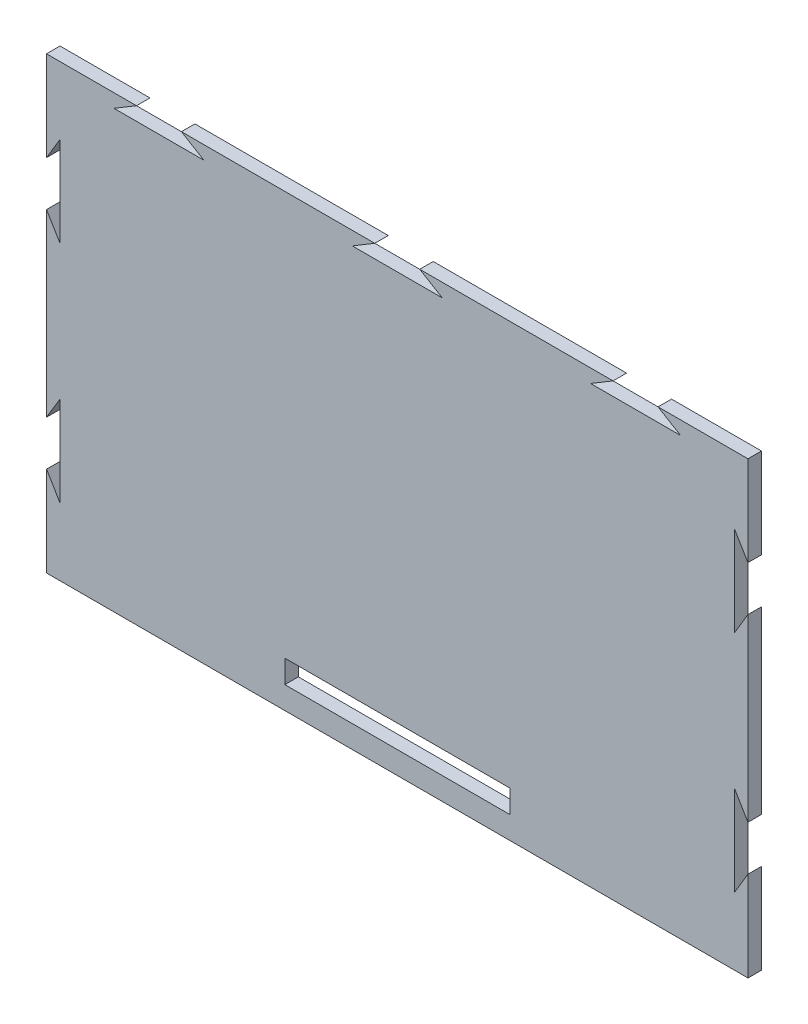
ISO-10303-21;
HEADER;
FILE_DESCRIPTION(('STEP AP214'),'2;1');
FILE_NAME('part.step','',(''),(''),'','','');
FILE_SCHEMA(('AUTOMOTIVE_DESIGN { 1 0 10303 214 1 1 1 1 }'));
ENDSEC;
DATA;
#1=APPLICATION_CONTEXT('core data for automotive mechanical design processes');
#2=APPLICATION_PROTOCOL_DEFINITION('international standard','automotive_design',2000,#1);
#3=PRODUCT_CONTEXT('',#1,'mechanical');
#4=PRODUCT('Part','Part','',(#3));
#5=PRODUCT_RELATED_PRODUCT_CATEGORY('part','',(#4));
#6=PRODUCT_DEFINITION_FORMATION('','',#4);
#7=PRODUCT_DEFINITION_CONTEXT('part definition',#1,'design');
#8=PRODUCT_DEFINITION('design','',#6,#7);
#9=PRODUCT_DEFINITION_SHAPE('','',#8);
#10=(LENGTH_UNIT() NAMED_UNIT(*) SI_UNIT(.MILLI.,.METRE.));
#11=(NAMED_UNIT(*) PLANE_ANGLE_UNIT() SI_UNIT($,.RADIAN.));
#12=(NAMED_UNIT(*) SI_UNIT($,.STERADIAN.) SOLID_ANGLE_UNIT());
#13=UNCERTAINTY_MEASURE_WITH_UNIT(LENGTH_MEASURE(1.E-05),#10,'distance_accuracy_value','');
#14=(GEOMETRIC_REPRESENTATION_CONTEXT(3) GLOBAL_UNCERTAINTY_ASSIGNED_CONTEXT((#13)) GLOBAL_UNIT_ASSIGNED_CONTEXT((#10,
#11,#12)) REPRESENTATION_CONTEXT('',''));
#15=CARTESIAN_POINT('',(0.,0.,0.));
#16=DIRECTION('',(0.,0.,1.));
#17=DIRECTION('',(1.,0.,0.));
#18=AXIS2_PLACEMENT_3D('',#15,#16,#17);
#19=CARTESIAN_POINT('',(-78.,-50.,3.));
#20=DIRECTION('',(1.,0.,0.));
#21=DIRECTION('',(0.,0.,-1.));
#22=AXIS2_PLACEMENT_3D('',#19,#20,#21);
#23=PLANE('',#22);
#24=DIRECTION('',(0.,-1.,0.));
#25=VECTOR('',#24,1.);
#26=CARTESIAN_POINT('',(-78.,-50.,3.));
#27=LINE('',#26,#25);
#28=CARTESIAN_POINT('',(-78.,20.,3.));
#29=VERTEX_POINT('',#28);
#30=CARTESIAN_POINT('',(-78.,-20.,3.));
#31=VERTEX_POINT('',#30);
#32=EDGE_CURVE('E500',#29,#31,#27,.T.);
#33=ORIENTED_EDGE('',*,*,#32,.F.);
#34=DIRECTION('',(0.,0.,-1.));
#35=VECTOR('',#34,1.);
#36=CARTESIAN_POINT('',(-78.,20.,3.));
#37=LINE('',#36,#35);
#38=CARTESIAN_POINT('',(-78.,20.,0.));
#39=VERTEX_POINT('',#38);
#40=EDGE_CURVE('E322',#29,#39,#37,.T.);
#41=ORIENTED_EDGE('',*,*,#40,.T.);
#42=DIRECTION('',(0.,-1.,0.));
#43=VECTOR('',#42,1.);
#44=CARTESIAN_POINT('',(-78.,-50.,0.));
#45=LINE('',#44,#43);
#46=CARTESIAN_POINT('',(-78.0000000000001,-20.0000000000001,0.));
#47=VERTEX_POINT('',#46);
#48=EDGE_CURVE('E517',#39,#47,#45,.T.);
#49=ORIENTED_EDGE('',*,*,#48,.T.);
#50=DIRECTION('',(0.,0.,-1.));
#51=VECTOR('',#50,1.);
#52=CARTESIAN_POINT('',(-78.,-20.,3.));
#53=LINE('',#52,#51);
#54=EDGE_CURVE('E341',#31,#47,#53,.T.);
#55=ORIENTED_EDGE('',*,*,#54,.F.);
#56=EDGE_LOOP('',(#33,#41,#49,#55));
#57=FACE_BOUND('',#56,.T.);
#58=ADVANCED_FACE('F33',(#57),#23,.F.);
#59=CARTESIAN_POINT('',(-78.,-30.,3.));
#60=VERTEX_POINT('',#59);
#61=CARTESIAN_POINT('',(-78.,-50.,3.));
#62=VERTEX_POINT('',#61);
#63=EDGE_CURVE('E494',#60,#62,#27,.T.);
#64=ORIENTED_EDGE('',*,*,#63,.F.);
#65=DIRECTION('',(0.,0.,-1.));
#66=VECTOR('',#65,1.);
#67=CARTESIAN_POINT('',(-78.,-30.,3.));
#68=LINE('',#67,#66);
#69=CARTESIAN_POINT('',(-78.,-30.,0.));
#70=VERTEX_POINT('',#69);
#71=EDGE_CURVE('E318',#60,#70,#68,.T.);
#72=ORIENTED_EDGE('',*,*,#71,.T.);
#73=CARTESIAN_POINT('',(-78.,-50.,0.));
#74=VERTEX_POINT('',#73);
#75=EDGE_CURVE('E511',#70,#74,#45,.T.);
#76=ORIENTED_EDGE('',*,*,#75,.T.);
#77=DIRECTION('',(0.,0.,-1.));
#78=VECTOR('',#77,1.);
#79=CARTESIAN_POINT('',(-78.,-50.,3.));
#80=LINE('',#79,#78);
#81=EDGE_CURVE('E521',#62,#74,#80,.T.);
#82=ORIENTED_EDGE('',*,*,#81,.F.);
#83=EDGE_LOOP('',(#64,#72,#76,#82));
#84=FACE_BOUND('',#83,.T.);
#85=ADVANCED_FACE('F595',(#84),#23,.F.);
#86=CARTESIAN_POINT('',(78.,-50.,3.));
#87=DIRECTION('',(-1.,0.,0.));
#88=DIRECTION('',(0.,0.,1.));
#89=AXIS2_PLACEMENT_3D('',#86,#87,#88);
#90=PLANE('',#89);
#91=DIRECTION('',(0.,1.,0.));
#92=VECTOR('',#91,1.);
#93=CARTESIAN_POINT('',(78.,-50.,3.));
#94=LINE('',#93,#92);
#95=CARTESIAN_POINT('',(78.,30.,3.));
#96=VERTEX_POINT('',#95);
#97=CARTESIAN_POINT('',(78.,50.,3.));
#98=VERTEX_POINT('',#97);
#99=EDGE_CURVE('E490',#96,#98,#94,.T.);
#100=ORIENTED_EDGE('',*,*,#99,.F.);
#101=DIRECTION('',(0.,0.,-1.));
#102=VECTOR('',#101,1.);
#103=CARTESIAN_POINT('',(78.,30.,3.));
#104=LINE('',#103,#102);
#105=CARTESIAN_POINT('',(78.,30.,0.));
#106=VERTEX_POINT('',#105);
#107=EDGE_CURVE('E374',#96,#106,#104,.T.);
#108=ORIENTED_EDGE('',*,*,#107,.T.);
#109=DIRECTION('',(0.,1.,0.));
#110=VECTOR('',#109,1.);
#111=CARTESIAN_POINT('',(78.,-50.,0.));
#112=LINE('',#111,#110);
#113=CARTESIAN_POINT('',(78.,50.,0.));
#114=VERTEX_POINT('',#113);
#115=EDGE_CURVE('E429',#106,#114,#112,.T.);
#116=ORIENTED_EDGE('',*,*,#115,.T.);
#117=DIRECTION('',(0.,0.,-1.));
#118=VECTOR('',#117,1.);
#119=CARTESIAN_POINT('',(78.,50.,3.));
#120=LINE('',#119,#118);
#121=EDGE_CURVE('E11',#98,#114,#120,.T.);
#122=ORIENTED_EDGE('',*,*,#121,.F.);
#123=EDGE_LOOP('',(#100,#108,#116,#122));
#124=FACE_BOUND('',#123,.T.);
#125=ADVANCED_FACE('F590',(#124),#90,.F.);
#126=CARTESIAN_POINT('',(78.,-20.,0.));
#127=VERTEX_POINT('',#126);
#128=CARTESIAN_POINT('',(78.,20.,0.));
#129=VERTEX_POINT('',#128);
#130=EDGE_CURVE('E507',#127,#129,#112,.T.);
#131=ORIENTED_EDGE('',*,*,#130,.T.);
#132=DIRECTION('',(0.,0.,-1.));
#133=VECTOR('',#132,1.);
#134=CARTESIAN_POINT('',(78.,20.,3.));
#135=LINE('',#134,#133);
#136=CARTESIAN_POINT('',(78.,20.,3.));
#137=VERTEX_POINT('',#136);
#138=EDGE_CURVE('E365',#137,#129,#135,.T.);
#139=ORIENTED_EDGE('',*,*,#138,.F.);
#140=CARTESIAN_POINT('',(78.,-20.,3.));
#141=VERTEX_POINT('',#140);
#142=EDGE_CURVE('E489',#141,#137,#94,.T.);
#143=ORIENTED_EDGE('',*,*,#142,.F.);
#144=DIRECTION('',(0.,0.,-1.));
#145=VECTOR('',#144,1.);
#146=CARTESIAN_POINT('',(78.,-20.,3.));
#147=LINE('',#146,#145);
#148=EDGE_CURVE('E370',#141,#127,#147,.T.);
#149=ORIENTED_EDGE('',*,*,#148,.T.);
#150=EDGE_LOOP('',(#131,#139,#143,#149));
#151=FACE_BOUND('',#150,.T.);
#152=ADVANCED_FACE('F591',(#151),#90,.F.);
#153=CARTESIAN_POINT('',(-78.,50.,3.));
#154=DIRECTION('',(0.,-1.,0.));
#155=DIRECTION('',(0.,0.,-1.));
#156=AXIS2_PLACEMENT_3D('',#153,#154,#155);
#157=PLANE('',#156);
#158=DIRECTION('',(-1.,0.,0.));
#159=VECTOR('',#158,1.);
#160=CARTESIAN_POINT('',(-78.,50.,3.));
#161=LINE('',#160,#159);
#162=CARTESIAN_POINT('',(48.,50.,3.));
#163=VERTEX_POINT('',#162);
#164=CARTESIAN_POINT('',(5.,50.,3.));
#165=VERTEX_POINT('',#164);
#166=EDGE_CURVE('E495',#163,#165,#161,.T.);
#167=ORIENTED_EDGE('',*,*,#166,.F.);
#168=DIRECTION('',(0.,0.,-1.));
#169=VECTOR('',#168,1.);
#170=CARTESIAN_POINT('',(48.,50.,3.));
#171=LINE('',#170,#169);
#172=CARTESIAN_POINT('',(48.,50.,0.));
#173=VERTEX_POINT('',#172);
#174=EDGE_CURVE('E426',#163,#173,#171,.T.);
#175=ORIENTED_EDGE('',*,*,#174,.T.);
#176=DIRECTION('',(-1.,0.,0.));
#177=VECTOR('',#176,1.);
#178=CARTESIAN_POINT('',(-78.,50.,0.));
#179=LINE('',#178,#177);
#180=CARTESIAN_POINT('',(5.,50.,0.));
#181=VERTEX_POINT('',#180);
#182=EDGE_CURVE('E512',#173,#181,#179,.T.);
#183=ORIENTED_EDGE('',*,*,#182,.T.);
#184=DIRECTION('',(0.,0.,-1.));
#185=VECTOR('',#184,1.);
#186=CARTESIAN_POINT('',(5.,50.,3.));
#187=LINE('',#186,#185);
#188=EDGE_CURVE('E454',#165,#181,#187,.T.);
#189=ORIENTED_EDGE('',*,*,#188,.F.);
#190=EDGE_LOOP('',(#167,#175,#183,#189));
#191=FACE_BOUND('',#190,.T.);
#192=ADVANCED_FACE('F551',(#191),#157,.F.);
#193=CARTESIAN_POINT('',(57.9999999999998,50.,0.));
#194=VERTEX_POINT('',#193);
#195=EDGE_CURVE('E508',#114,#194,#179,.T.);
#196=ORIENTED_EDGE('',*,*,#195,.T.);
#197=DIRECTION('',(0.,0.,-1.));
#198=VECTOR('',#197,1.);
#199=CARTESIAN_POINT('',(58.,50.,3.));
#200=LINE('',#199,#198);
#201=CARTESIAN_POINT('',(58.,50.,3.));
#202=VERTEX_POINT('',#201);
#203=EDGE_CURVE('E417',#202,#194,#200,.T.);
#204=ORIENTED_EDGE('',*,*,#203,.F.);
#205=EDGE_CURVE('E491',#98,#202,#161,.T.);
#206=ORIENTED_EDGE('',*,*,#205,.F.);
#207=ORIENTED_EDGE('',*,*,#121,.T.);
#208=EDGE_LOOP('',(#196,#204,#206,#207));
#209=FACE_BOUND('',#208,.T.);
#210=ADVANCED_FACE('F583',(#209),#157,.F.);
#211=CARTESIAN_POINT('',(-58.,50.,3.));
#212=VERTEX_POINT('',#211);
#213=CARTESIAN_POINT('',(-78.,50.,3.));
#214=VERTEX_POINT('',#213);
#215=EDGE_CURVE('E488',#212,#214,#161,.T.);
#216=ORIENTED_EDGE('',*,*,#215,.F.);
#217=DIRECTION('',(0.,0.,-1.));
#218=VECTOR('',#217,1.);
#219=CARTESIAN_POINT('',(-58.,50.,3.));
#220=LINE('',#219,#218);
#221=CARTESIAN_POINT('',(-58.,50.,0.));
#222=VERTEX_POINT('',#221);
#223=EDGE_CURVE('E449',#212,#222,#220,.T.);
#224=ORIENTED_EDGE('',*,*,#223,.T.);
#225=CARTESIAN_POINT('',(-78.,50.,0.));
#226=VERTEX_POINT('',#225);
#227=EDGE_CURVE('E506',#222,#226,#179,.T.);
#228=ORIENTED_EDGE('',*,*,#227,.T.);
#229=DIRECTION('',(0.,0.,-1.));
#230=VECTOR('',#229,1.);
#231=CARTESIAN_POINT('',(-78.,50.,3.));
#232=LINE('',#231,#230);
#233=EDGE_CURVE('E41',#214,#226,#232,.T.);
#234=ORIENTED_EDGE('',*,*,#233,.F.);
#235=EDGE_LOOP('',(#216,#224,#228,#234));
#236=FACE_BOUND('',#235,.T.);
#237=ADVANCED_FACE('F581',(#236),#157,.F.);
#238=CARTESIAN_POINT('',(78.,-50.,0.));
#239=VERTEX_POINT('',#238);
#240=CARTESIAN_POINT('',(78.,-30.,0.));
#241=VERTEX_POINT('',#240);
#242=EDGE_CURVE('E503',#239,#241,#112,.T.);
#243=ORIENTED_EDGE('',*,*,#242,.T.);
#244=DIRECTION('',(0.,0.,-1.));
#245=VECTOR('',#244,1.);
#246=CARTESIAN_POINT('',(78.,-30.,3.));
#247=LINE('',#246,#245);
#248=CARTESIAN_POINT('',(78.,-30.,3.));
#249=VERTEX_POINT('',#248);
#250=EDGE_CURVE('E393',#249,#241,#247,.T.);
#251=ORIENTED_EDGE('',*,*,#250,.F.);
#252=CARTESIAN_POINT('',(78.,-50.,3.));
#253=VERTEX_POINT('',#252);
#254=EDGE_CURVE('E485',#253,#249,#94,.T.);
#255=ORIENTED_EDGE('',*,*,#254,.F.);
#256=DIRECTION('',(0.,0.,-1.));
#257=VECTOR('',#256,1.);
#258=CARTESIAN_POINT('',(78.,-50.,3.));
#259=LINE('',#258,#257);
#260=EDGE_CURVE('E502',#253,#239,#259,.T.);
#261=ORIENTED_EDGE('',*,*,#260,.T.);
#262=EDGE_LOOP('',(#243,#251,#255,#261));
#263=FACE_BOUND('',#262,.T.);
#264=ADVANCED_FACE('F35',(#263),#90,.F.);
#265=CARTESIAN_POINT('',(-5.,50.,3.));
#266=VERTEX_POINT('',#265);
#267=CARTESIAN_POINT('',(-48.,50.,3.));
#268=VERTEX_POINT('',#267);
#269=EDGE_CURVE('E543',#266,#268,#161,.T.);
#270=ORIENTED_EDGE('',*,*,#269,.F.);
#271=DIRECTION('',(0.,0.,-1.));
#272=VECTOR('',#271,1.);
#273=CARTESIAN_POINT('',(-5.,50.,3.));
#274=LINE('',#273,#272);
#275=CARTESIAN_POINT('',(-5.,50.,0.));
#276=VERTEX_POINT('',#275);
#277=EDGE_CURVE('E456',#266,#276,#274,.T.);
#278=ORIENTED_EDGE('',*,*,#277,.T.);
#279=CARTESIAN_POINT('',(-48.0000000000001,50.,0.));
#280=VERTEX_POINT('',#279);
#281=EDGE_CURVE('E571',#276,#280,#179,.T.);
#282=ORIENTED_EDGE('',*,*,#281,.T.);
#283=DIRECTION('',(0.,0.,-1.));
#284=VECTOR('',#283,1.);
#285=CARTESIAN_POINT('',(-48.,50.,3.));
#286=LINE('',#285,#284);
#287=EDGE_CURVE('E471',#268,#280,#286,.T.);
#288=ORIENTED_EDGE('',*,*,#287,.F.);
#289=EDGE_LOOP('',(#270,#278,#282,#288));
#290=FACE_BOUND('',#289,.T.);
#291=ADVANCED_FACE('F569',(#290),#157,.F.);
#292=CARTESIAN_POINT('',(-78.,30.,0.));
#293=VERTEX_POINT('',#292);
#294=EDGE_CURVE('E513',#226,#293,#45,.T.);
#295=ORIENTED_EDGE('',*,*,#294,.T.);
#296=DIRECTION('',(0.,0.,-1.));
#297=VECTOR('',#296,1.);
#298=CARTESIAN_POINT('',(-78.,30.,3.));
#299=LINE('',#298,#297);
#300=CARTESIAN_POINT('',(-78.,30.,3.));
#301=VERTEX_POINT('',#300);
#302=EDGE_CURVE('E313',#301,#293,#299,.T.);
#303=ORIENTED_EDGE('',*,*,#302,.F.);
#304=EDGE_CURVE('E496',#214,#301,#27,.T.);
#305=ORIENTED_EDGE('',*,*,#304,.F.);
#306=ORIENTED_EDGE('',*,*,#233,.T.);
#307=EDGE_LOOP('',(#295,#303,#305,#306));
#308=FACE_BOUND('',#307,.T.);
#309=ADVANCED_FACE('F528',(#308),#23,.F.);
#310=CARTESIAN_POINT('',(-78.,-50.,3.));
#311=DIRECTION('',(0.,1.,0.));
#312=DIRECTION('',(0.,0.,1.));
#313=AXIS2_PLACEMENT_3D('',#310,#311,#312);
#314=PLANE('',#313);
#315=DIRECTION('',(1.,0.,0.));
#316=VECTOR('',#315,1.);
#317=CARTESIAN_POINT('',(-78.,-50.,0.));
#318=LINE('',#317,#316);
#319=EDGE_CURVE('E516',#74,#239,#318,.T.);
#320=ORIENTED_EDGE('',*,*,#319,.T.);
#321=ORIENTED_EDGE('',*,*,#260,.F.);
#322=DIRECTION('',(1.,0.,0.));
#323=VECTOR('',#322,1.);
#324=CARTESIAN_POINT('',(-78.,-50.,3.));
#325=LINE('',#324,#323);
#326=EDGE_CURVE('E499',#62,#253,#325,.T.);
#327=ORIENTED_EDGE('',*,*,#326,.F.);
#328=ORIENTED_EDGE('',*,*,#81,.T.);
#329=EDGE_LOOP('',(#320,#321,#327,#328));
#330=FACE_BOUND('',#329,.T.);
#331=ADVANCED_FACE('F605',(#330),#314,.F.);
#332=CARTESIAN_POINT('',(0.,0.,3.));
#333=DIRECTION('',(0.,0.,-1.));
#334=DIRECTION('',(-1.,0.,0.));
#335=AXIS2_PLACEMENT_3D('',#332,#333,#334);
#336=PLANE('',#335);
#337=DIRECTION('',(-1.,0.,0.));
#338=VECTOR('',#337,1.);
#339=CARTESIAN_POINT('',(25.1,-45.,3.));
#340=LINE('',#339,#338);
#341=CARTESIAN_POINT('',(25.1,-45.,3.));
#342=VERTEX_POINT('',#341);
#343=CARTESIAN_POINT('',(-25.,-45.,3.));
#344=VERTEX_POINT('',#343);
#345=EDGE_CURVE('E274',#342,#344,#340,.T.);
#346=ORIENTED_EDGE('',*,*,#345,.T.);
#347=DIRECTION('',(0.,1.,0.));
#348=VECTOR('',#347,1.);
#349=CARTESIAN_POINT('',(-25.,-39.9,3.));
#350=LINE('',#349,#348);
#351=CARTESIAN_POINT('',(-25.,-39.9,3.));
#352=VERTEX_POINT('',#351);
#353=EDGE_CURVE('E268',#344,#352,#350,.T.);
#354=ORIENTED_EDGE('',*,*,#353,.T.);
#355=DIRECTION('',(1.,0.,0.));
#356=VECTOR('',#355,1.);
#357=CARTESIAN_POINT('',(25.1,-39.9,3.));
#358=LINE('',#357,#356);
#359=CARTESIAN_POINT('',(25.1,-39.9,3.));
#360=VERTEX_POINT('',#359);
#361=EDGE_CURVE('E277',#352,#360,#358,.T.);
#362=ORIENTED_EDGE('',*,*,#361,.T.);
#363=DIRECTION('',(0.,-1.,0.));
#364=VECTOR('',#363,1.);
#365=CARTESIAN_POINT('',(25.1,-39.9,3.));
#366=LINE('',#365,#364);
#367=EDGE_CURVE('E48',#360,#342,#366,.T.);
#368=ORIENTED_EDGE('',*,*,#367,.T.);
#369=EDGE_LOOP('',(#346,#354,#362,#368));
#370=FACE_BOUND('',#369,.T.);
#371=DIRECTION('',(0.,-1.,0.));
#372=VECTOR('',#371,1.);
#373=CARTESIAN_POINT('',(-75.,35.,3.));
#374=LINE('',#373,#372);
#375=CARTESIAN_POINT('',(-75.,35.,3.));
#376=VERTEX_POINT('',#375);
#377=CARTESIAN_POINT('',(-75.,15.,3.));
#378=VERTEX_POINT('',#377);
#379=EDGE_CURVE('E306',#376,#378,#374,.T.);
#380=ORIENTED_EDGE('',*,*,#379,.T.);
#381=DIRECTION('',(-0.51449575542753,0.857492925712542,0.));
#382=VECTOR('',#381,1.);
#383=CARTESIAN_POINT('',(-75.,15.,3.));
#384=LINE('',#383,#382);
#385=EDGE_CURVE('E310',#378,#29,#384,.T.);
#386=ORIENTED_EDGE('',*,*,#385,.T.);
#387=ORIENTED_EDGE('',*,*,#32,.T.);
#388=DIRECTION('',(0.514495755427527,0.857492925712544,0.));
#389=VECTOR('',#388,1.);
#390=CARTESIAN_POINT('',(-78.,-20.,3.));
#391=LINE('',#390,#389);
#392=CARTESIAN_POINT('',(-75.,-15.,3.));
#393=VERTEX_POINT('',#392);
#394=EDGE_CURVE('E331',#31,#393,#391,.T.);
#395=ORIENTED_EDGE('',*,*,#394,.T.);
#396=DIRECTION('',(0.,-1.,0.));
#397=VECTOR('',#396,1.);
#398=CARTESIAN_POINT('',(-75.,-15.,3.));
#399=LINE('',#398,#397);
#400=CARTESIAN_POINT('',(-75.,-35.,3.));
#401=VERTEX_POINT('',#400);
#402=EDGE_CURVE('E334',#393,#401,#399,.T.);
#403=ORIENTED_EDGE('',*,*,#402,.T.);
#404=DIRECTION('',(-0.514495755427528,0.857492925712544,0.));
#405=VECTOR('',#404,1.);
#406=CARTESIAN_POINT('',(-75.,-35.,3.));
#407=LINE('',#406,#405);
#408=EDGE_CURVE('E338',#401,#60,#407,.T.);
#409=ORIENTED_EDGE('',*,*,#408,.T.);
#410=ORIENTED_EDGE('',*,*,#63,.T.);
#411=ORIENTED_EDGE('',*,*,#326,.T.);
#412=ORIENTED_EDGE('',*,*,#254,.T.);
#413=DIRECTION('',(-0.514495755427527,-0.857492925712544,0.));
#414=VECTOR('',#413,1.);
#415=CARTESIAN_POINT('',(75.,-35.,3.));
#416=LINE('',#415,#414);
#417=CARTESIAN_POINT('',(75.,-35.,3.));
#418=VERTEX_POINT('',#417);
#419=EDGE_CURVE('E383',#249,#418,#416,.T.);
#420=ORIENTED_EDGE('',*,*,#419,.T.);
#421=DIRECTION('',(0.,1.,0.));
#422=VECTOR('',#421,1.);
#423=CARTESIAN_POINT('',(75.,-15.,3.));
#424=LINE('',#423,#422);
#425=CARTESIAN_POINT('',(75.,-15.,3.));
#426=VERTEX_POINT('',#425);
#427=EDGE_CURVE('E386',#418,#426,#424,.T.);
#428=ORIENTED_EDGE('',*,*,#427,.T.);
#429=DIRECTION('',(0.514495755427527,-0.857492925712544,0.));
#430=VECTOR('',#429,1.);
#431=CARTESIAN_POINT('',(78.,-20.,3.));
#432=LINE('',#431,#430);
#433=EDGE_CURVE('E390',#426,#141,#432,.T.);
#434=ORIENTED_EDGE('',*,*,#433,.T.);
#435=ORIENTED_EDGE('',*,*,#142,.T.);
#436=DIRECTION('',(-0.514495755427527,-0.857492925712544,0.));
#437=VECTOR('',#436,1.);
#438=CARTESIAN_POINT('',(75.,15.,3.));
#439=LINE('',#438,#437);
#440=CARTESIAN_POINT('',(75.,15.,3.));
#441=VERTEX_POINT('',#440);
#442=EDGE_CURVE('E355',#137,#441,#439,.T.);
#443=ORIENTED_EDGE('',*,*,#442,.T.);
#444=DIRECTION('',(0.,1.,0.));
#445=VECTOR('',#444,1.);
#446=CARTESIAN_POINT('',(75.,35.,3.));
#447=LINE('',#446,#445);
#448=CARTESIAN_POINT('',(75.,35.,3.));
#449=VERTEX_POINT('',#448);
#450=EDGE_CURVE('E358',#441,#449,#447,.T.);
#451=ORIENTED_EDGE('',*,*,#450,.T.);
#452=DIRECTION('',(0.514495755427527,-0.857492925712544,0.));
#453=VECTOR('',#452,1.);
#454=CARTESIAN_POINT('',(78.,30.,3.));
#455=LINE('',#454,#453);
#456=EDGE_CURVE('E362',#449,#96,#455,.T.);
#457=ORIENTED_EDGE('',*,*,#456,.T.);
#458=ORIENTED_EDGE('',*,*,#99,.T.);
#459=ORIENTED_EDGE('',*,*,#205,.T.);
#460=DIRECTION('',(0.857492925712544,-0.514495755427527,0.));
#461=VECTOR('',#460,1.);
#462=CARTESIAN_POINT('',(58.,50.,3.));
#463=LINE('',#462,#461);
#464=CARTESIAN_POINT('',(63.,47.,3.));
#465=VERTEX_POINT('',#464);
#466=EDGE_CURVE('E407',#202,#465,#463,.T.);
#467=ORIENTED_EDGE('',*,*,#466,.T.);
#468=DIRECTION('',(-1.,0.,0.));
#469=VECTOR('',#468,1.);
#470=CARTESIAN_POINT('',(63.,47.,3.));
#471=LINE('',#470,#469);
#472=CARTESIAN_POINT('',(43.,47.,3.));
#473=VERTEX_POINT('',#472);
#474=EDGE_CURVE('E410',#465,#473,#471,.T.);
#475=ORIENTED_EDGE('',*,*,#474,.T.);
#476=DIRECTION('',(0.857492925712544,0.514495755427527,0.));
#477=VECTOR('',#476,1.);
#478=CARTESIAN_POINT('',(43.,47.,3.));
#479=LINE('',#478,#477);
#480=EDGE_CURVE('E414',#473,#163,#479,.T.);
#481=ORIENTED_EDGE('',*,*,#480,.T.);
#482=ORIENTED_EDGE('',*,*,#166,.T.);
#483=DIRECTION('',(0.857492925712544,-0.514495755427527,0.));
#484=VECTOR('',#483,1.);
#485=CARTESIAN_POINT('',(10.,47.,3.));
#486=LINE('',#485,#484);
#487=CARTESIAN_POINT('',(10.,47.,3.));
#488=VERTEX_POINT('',#487);
#489=EDGE_CURVE('E442',#165,#488,#486,.T.);
#490=ORIENTED_EDGE('',*,*,#489,.T.);
#491=DIRECTION('',(-1.,0.,0.));
#492=VECTOR('',#491,1.);
#493=CARTESIAN_POINT('',(-10.,47.,3.));
#494=LINE('',#493,#492);
#495=CARTESIAN_POINT('',(-10.,47.,3.));
#496=VERTEX_POINT('',#495);
#497=EDGE_CURVE('E435',#488,#496,#494,.T.);
#498=ORIENTED_EDGE('',*,*,#497,.T.);
#499=DIRECTION('',(0.857492925712544,0.514495755427527,0.));
#500=VECTOR('',#499,1.);
#501=CARTESIAN_POINT('',(-5.,50.,3.));
#502=LINE('',#501,#500);
#503=EDGE_CURVE('E438',#496,#266,#502,.T.);
#504=ORIENTED_EDGE('',*,*,#503,.T.);
#505=ORIENTED_EDGE('',*,*,#269,.T.);
#506=DIRECTION('',(0.857492925712544,-0.514495755427527,0.));
#507=VECTOR('',#506,1.);
#508=CARTESIAN_POINT('',(-48.,50.,3.));
#509=LINE('',#508,#507);
#510=CARTESIAN_POINT('',(-43.,47.,3.));
#511=VERTEX_POINT('',#510);
#512=EDGE_CURVE('E461',#268,#511,#509,.T.);
#513=ORIENTED_EDGE('',*,*,#512,.T.);
#514=DIRECTION('',(-1.,0.,0.));
#515=VECTOR('',#514,1.);
#516=CARTESIAN_POINT('',(-43.,47.,3.));
#517=LINE('',#516,#515);
#518=CARTESIAN_POINT('',(-63.,47.,3.));
#519=VERTEX_POINT('',#518);
#520=EDGE_CURVE('E464',#511,#519,#517,.T.);
#521=ORIENTED_EDGE('',*,*,#520,.T.);
#522=DIRECTION('',(0.857492925712544,0.514495755427527,0.));
#523=VECTOR('',#522,1.);
#524=CARTESIAN_POINT('',(-63.,47.,3.));
#525=LINE('',#524,#523);
#526=EDGE_CURVE('E468',#519,#212,#525,.T.);
#527=ORIENTED_EDGE('',*,*,#526,.T.);
#528=ORIENTED_EDGE('',*,*,#215,.T.);
#529=ORIENTED_EDGE('',*,*,#304,.T.);
#530=DIRECTION('',(0.514495755427529,0.857492925712543,0.));
#531=VECTOR('',#530,1.);
#532=CARTESIAN_POINT('',(-78.,30.,3.));
#533=LINE('',#532,#531);
#534=EDGE_CURVE('E303',#301,#376,#533,.T.);
#535=ORIENTED_EDGE('',*,*,#534,.T.);
#536=EDGE_LOOP('',(#380,#386,#387,#395,#403,#409,#410,#411,#412,#420,#428,#434,#435,#443,#451,
#457,#458,#459,#467,#475,#481,#482,#490,#498,#504,#505,#513,#521,#527,#528,#529,#535));
#537=FACE_BOUND('',#536,.T.);
#538=ADVANCED_FACE('F281',(#370,#537),#336,.F.);
#539=CARTESIAN_POINT('',(0.,0.,0.));
#540=DIRECTION('',(0.,0.,-1.));
#541=DIRECTION('',(-1.,0.,0.));
#542=AXIS2_PLACEMENT_3D('',#539,#540,#541);
#543=PLANE('',#542);
#544=DIRECTION('',(0.,1.,0.));
#545=VECTOR('',#544,1.);
#546=CARTESIAN_POINT('',(-25.,-39.9,0.));
#547=LINE('',#546,#545);
#548=CARTESIAN_POINT('',(-25.,-45.,0.));
#549=VERTEX_POINT('',#548);
#550=CARTESIAN_POINT('',(-25.,-39.9,0.));
#551=VERTEX_POINT('',#550);
#552=EDGE_CURVE('E56',#549,#551,#547,.T.);
#553=ORIENTED_EDGE('',*,*,#552,.F.);
#554=DIRECTION('',(-1.,0.,0.));
#555=VECTOR('',#554,1.);
#556=CARTESIAN_POINT('',(25.1,-45.,0.));
#557=LINE('',#556,#555);
#558=CARTESIAN_POINT('',(25.1,-45.,0.));
#559=VERTEX_POINT('',#558);
#560=EDGE_CURVE('E284',#559,#549,#557,.T.);
#561=ORIENTED_EDGE('',*,*,#560,.F.);
#562=DIRECTION('',(0.,-1.,0.));
#563=VECTOR('',#562,1.);
#564=CARTESIAN_POINT('',(25.1,-39.9,0.));
#565=LINE('',#564,#563);
#566=CARTESIAN_POINT('',(25.1,-39.9,0.));
#567=VERTEX_POINT('',#566);
#568=EDGE_CURVE('E287',#567,#559,#565,.T.);
#569=ORIENTED_EDGE('',*,*,#568,.F.);
#570=DIRECTION('',(1.,0.,0.));
#571=VECTOR('',#570,1.);
#572=CARTESIAN_POINT('',(25.1,-39.9,0.));
#573=LINE('',#572,#571);
#574=EDGE_CURVE('E293',#551,#567,#573,.T.);
#575=ORIENTED_EDGE('',*,*,#574,.F.);
#576=EDGE_LOOP('',(#553,#561,#569,#575));
#577=FACE_BOUND('',#576,.T.);
#578=DIRECTION('',(-0.51449575542753,0.857492925712542,0.));
#579=VECTOR('',#578,1.);
#580=CARTESIAN_POINT('',(-75.,15.,0.));
#581=LINE('',#580,#579);
#582=CARTESIAN_POINT('',(-75.,15.,0.));
#583=VERTEX_POINT('',#582);
#584=EDGE_CURVE('E307',#583,#39,#581,.T.);
#585=ORIENTED_EDGE('',*,*,#584,.F.);
#586=DIRECTION('',(0.,-1.,0.));
#587=VECTOR('',#586,1.);
#588=CARTESIAN_POINT('',(-75.,35.,0.));
#589=LINE('',#588,#587);
#590=CARTESIAN_POINT('',(-75.,35.,0.));
#591=VERTEX_POINT('',#590);
#592=EDGE_CURVE('E317',#591,#583,#589,.T.);
#593=ORIENTED_EDGE('',*,*,#592,.F.);
#594=DIRECTION('',(0.514495755427529,0.857492925712543,0.));
#595=VECTOR('',#594,1.);
#596=CARTESIAN_POINT('',(-78.,30.,0.));
#597=LINE('',#596,#595);
#598=EDGE_CURVE('E314',#293,#591,#597,.T.);
#599=ORIENTED_EDGE('',*,*,#598,.F.);
#600=ORIENTED_EDGE('',*,*,#294,.F.);
#601=ORIENTED_EDGE('',*,*,#227,.F.);
#602=DIRECTION('',(0.857492925712544,0.514495755427527,0.));
#603=VECTOR('',#602,1.);
#604=CARTESIAN_POINT('',(-63.,47.,0.));
#605=LINE('',#604,#603);
#606=CARTESIAN_POINT('',(-63.,47.,0.));
#607=VERTEX_POINT('',#606);
#608=EDGE_CURVE('E465',#607,#222,#605,.T.);
#609=ORIENTED_EDGE('',*,*,#608,.F.);
#610=DIRECTION('',(-1.,0.,0.));
#611=VECTOR('',#610,1.);
#612=CARTESIAN_POINT('',(-43.,47.,0.));
#613=LINE('',#612,#611);
#614=CARTESIAN_POINT('',(-43.,47.,0.));
#615=VERTEX_POINT('',#614);
#616=EDGE_CURVE('E474',#615,#607,#613,.T.);
#617=ORIENTED_EDGE('',*,*,#616,.F.);
#618=DIRECTION('',(0.857492925712544,-0.514495755427527,0.));
#619=VECTOR('',#618,1.);
#620=CARTESIAN_POINT('',(-48.,50.,0.));
#621=LINE('',#620,#619);
#622=EDGE_CURVE('E377',#280,#615,#621,.T.);
#623=ORIENTED_EDGE('',*,*,#622,.F.);
#624=ORIENTED_EDGE('',*,*,#281,.F.);
#625=DIRECTION('',(0.857492925712544,0.514495755427527,0.));
#626=VECTOR('',#625,1.);
#627=CARTESIAN_POINT('',(-5.,50.,0.));
#628=LINE('',#627,#626);
#629=CARTESIAN_POINT('',(-10.,47.,0.));
#630=VERTEX_POINT('',#629);
#631=EDGE_CURVE('E448',#630,#276,#628,.T.);
#632=ORIENTED_EDGE('',*,*,#631,.F.);
#633=DIRECTION('',(-1.,0.,0.));
#634=VECTOR('',#633,1.);
#635=CARTESIAN_POINT('',(-10.,47.,0.));
#636=LINE('',#635,#634);
#637=CARTESIAN_POINT('',(10.,47.,0.));
#638=VERTEX_POINT('',#637);
#639=EDGE_CURVE('E446',#638,#630,#636,.T.);
#640=ORIENTED_EDGE('',*,*,#639,.F.);
#641=DIRECTION('',(0.857492925712544,-0.514495755427527,0.));
#642=VECTOR('',#641,1.);
#643=CARTESIAN_POINT('',(10.,47.,0.));
#644=LINE('',#643,#642);
#645=EDGE_CURVE('E439',#181,#638,#644,.T.);
#646=ORIENTED_EDGE('',*,*,#645,.F.);
#647=ORIENTED_EDGE('',*,*,#182,.F.);
#648=DIRECTION('',(0.857492925712544,0.514495755427527,0.));
#649=VECTOR('',#648,1.);
#650=CARTESIAN_POINT('',(43.,47.,0.));
#651=LINE('',#650,#649);
#652=CARTESIAN_POINT('',(43.,47.,0.));
#653=VERTEX_POINT('',#652);
#654=EDGE_CURVE('E411',#653,#173,#651,.T.);
#655=ORIENTED_EDGE('',*,*,#654,.F.);
#656=DIRECTION('',(-1.,0.,0.));
#657=VECTOR('',#656,1.);
#658=CARTESIAN_POINT('',(63.,47.,0.));
#659=LINE('',#658,#657);
#660=CARTESIAN_POINT('',(63.,47.,0.));
#661=VERTEX_POINT('',#660);
#662=EDGE_CURVE('E421',#661,#653,#659,.T.);
#663=ORIENTED_EDGE('',*,*,#662,.F.);
#664=DIRECTION('',(0.857492925712544,-0.514495755427527,0.));
#665=VECTOR('',#664,1.);
#666=CARTESIAN_POINT('',(58.,50.,0.));
#667=LINE('',#666,#665);
#668=EDGE_CURVE('E418',#194,#661,#667,.T.);
#669=ORIENTED_EDGE('',*,*,#668,.F.);
#670=ORIENTED_EDGE('',*,*,#195,.F.);
#671=ORIENTED_EDGE('',*,*,#115,.F.);
#672=DIRECTION('',(0.514495755427527,-0.857492925712544,0.));
#673=VECTOR('',#672,1.);
#674=CARTESIAN_POINT('',(78.,30.,0.));
#675=LINE('',#674,#673);
#676=CARTESIAN_POINT('',(75.,35.,0.));
#677=VERTEX_POINT('',#676);
#678=EDGE_CURVE('E359',#677,#106,#675,.T.);
#679=ORIENTED_EDGE('',*,*,#678,.F.);
#680=DIRECTION('',(0.,1.,0.));
#681=VECTOR('',#680,1.);
#682=CARTESIAN_POINT('',(75.,35.,0.));
#683=LINE('',#682,#681);
#684=CARTESIAN_POINT('',(75.,15.,0.));
#685=VERTEX_POINT('',#684);
#686=EDGE_CURVE('E369',#685,#677,#683,.T.);
#687=ORIENTED_EDGE('',*,*,#686,.F.);
#688=DIRECTION('',(-0.514495755427527,-0.857492925712544,0.));
#689=VECTOR('',#688,1.);
#690=CARTESIAN_POINT('',(75.,15.,0.));
#691=LINE('',#690,#689);
#692=EDGE_CURVE('E366',#129,#685,#691,.T.);
#693=ORIENTED_EDGE('',*,*,#692,.F.);
#694=ORIENTED_EDGE('',*,*,#130,.F.);
#695=DIRECTION('',(0.514495755427527,-0.857492925712544,0.));
#696=VECTOR('',#695,1.);
#697=CARTESIAN_POINT('',(78.,-20.,0.));
#698=LINE('',#697,#696);
#699=CARTESIAN_POINT('',(75.,-15.,0.));
#700=VERTEX_POINT('',#699);
#701=EDGE_CURVE('E387',#700,#127,#698,.T.);
#702=ORIENTED_EDGE('',*,*,#701,.F.);
#703=DIRECTION('',(0.,1.,0.));
#704=VECTOR('',#703,1.);
#705=CARTESIAN_POINT('',(75.,-15.,0.));
#706=LINE('',#705,#704);
#707=CARTESIAN_POINT('',(75.,-35.,0.));
#708=VERTEX_POINT('',#707);
#709=EDGE_CURVE('E396',#708,#700,#706,.T.);
#710=ORIENTED_EDGE('',*,*,#709,.F.);
#711=DIRECTION('',(-0.514495755427527,-0.857492925712544,0.));
#712=VECTOR('',#711,1.);
#713=CARTESIAN_POINT('',(75.,-35.,0.));
#714=LINE('',#713,#712);
#715=EDGE_CURVE('E325',#241,#708,#714,.T.);
#716=ORIENTED_EDGE('',*,*,#715,.F.);
#717=ORIENTED_EDGE('',*,*,#242,.F.);
#718=ORIENTED_EDGE('',*,*,#319,.F.);
#719=ORIENTED_EDGE('',*,*,#75,.F.);
#720=DIRECTION('',(-0.514495755427528,0.857492925712544,0.));
#721=VECTOR('',#720,1.);
#722=CARTESIAN_POINT('',(-75.,-35.,0.));
#723=LINE('',#722,#721);
#724=CARTESIAN_POINT('',(-75.,-35.,0.));
#725=VERTEX_POINT('',#724);
#726=EDGE_CURVE('E335',#725,#70,#723,.T.);
#727=ORIENTED_EDGE('',*,*,#726,.F.);
#728=DIRECTION('',(0.,-1.,0.));
#729=VECTOR('',#728,1.);
#730=CARTESIAN_POINT('',(-75.,-15.,0.));
#731=LINE('',#730,#729);
#732=CARTESIAN_POINT('',(-75.,-15.,0.));
#733=VERTEX_POINT('',#732);
#734=EDGE_CURVE('E344',#733,#725,#731,.T.);
#735=ORIENTED_EDGE('',*,*,#734,.F.);
#736=DIRECTION('',(0.514495755427527,0.857492925712544,0.));
#737=VECTOR('',#736,1.);
#738=CARTESIAN_POINT('',(-78.,-20.,0.));
#739=LINE('',#738,#737);
#740=EDGE_CURVE('E299',#47,#733,#739,.T.);
#741=ORIENTED_EDGE('',*,*,#740,.F.);
#742=ORIENTED_EDGE('',*,*,#48,.F.);
#743=EDGE_LOOP('',(#585,#593,#599,#600,#601,#609,#617,#623,#624,#632,#640,#646,#647,#655,#663,
#669,#670,#671,#679,#687,#693,#694,#702,#710,#716,#717,#718,#719,#727,#735,#741,#742));
#744=FACE_BOUND('',#743,.T.);
#745=ADVANCED_FACE('F536',(#577,#744),#543,.T.);
#746=CARTESIAN_POINT('',(-63.,47.,3.));
#747=DIRECTION('',(-0.514495755427527,0.857492925712544,0.));
#748=DIRECTION('',(-0.857492925712544,-0.514495755427527,0.));
#749=AXIS2_PLACEMENT_3D('',#746,#747,#748);
#750=PLANE('',#749);
#751=ORIENTED_EDGE('',*,*,#608,.T.);
#752=ORIENTED_EDGE('',*,*,#223,.F.);
#753=ORIENTED_EDGE('',*,*,#526,.F.);
#754=DIRECTION('',(0.,0.,-1.));
#755=VECTOR('',#754,1.);
#756=CARTESIAN_POINT('',(-63.,47.,3.));
#757=LINE('',#756,#755);
#758=EDGE_CURVE('E480',#519,#607,#757,.T.);
#759=ORIENTED_EDGE('',*,*,#758,.T.);
#760=EDGE_LOOP('',(#751,#752,#753,#759));
#761=FACE_BOUND('',#760,.T.);
#762=ADVANCED_FACE('F580',(#761),#750,.F.);
#763=CARTESIAN_POINT('',(-43.,47.,3.));
#764=DIRECTION('',(0.,-1.,0.));
#765=DIRECTION('',(0.,0.,-1.));
#766=AXIS2_PLACEMENT_3D('',#763,#764,#765);
#767=PLANE('',#766);
#768=ORIENTED_EDGE('',*,*,#616,.T.);
#769=ORIENTED_EDGE('',*,*,#758,.F.);
#770=ORIENTED_EDGE('',*,*,#520,.F.);
#771=DIRECTION('',(0.,0.,-1.));
#772=VECTOR('',#771,1.);
#773=CARTESIAN_POINT('',(-43.,47.,3.));
#774=LINE('',#773,#772);
#775=EDGE_CURVE('E482',#511,#615,#774,.T.);
#776=ORIENTED_EDGE('',*,*,#775,.T.);
#777=EDGE_LOOP('',(#768,#769,#770,#776));
#778=FACE_BOUND('',#777,.T.);
#779=ADVANCED_FACE('F577',(#778),#767,.F.);
#780=CARTESIAN_POINT('',(-48.,50.,3.));
#781=DIRECTION('',(0.514495755427527,0.857492925712544,0.));
#782=DIRECTION('',(-0.857492925712544,0.514495755427527,0.));
#783=AXIS2_PLACEMENT_3D('',#780,#781,#782);
#784=PLANE('',#783);
#785=ORIENTED_EDGE('',*,*,#622,.T.);
#786=ORIENTED_EDGE('',*,*,#775,.F.);
#787=ORIENTED_EDGE('',*,*,#512,.F.);
#788=ORIENTED_EDGE('',*,*,#287,.T.);
#789=EDGE_LOOP('',(#785,#786,#787,#788));
#790=FACE_BOUND('',#789,.T.);
#791=ADVANCED_FACE('F574',(#790),#784,.F.);
#792=CARTESIAN_POINT('',(-10.,47.,3.));
#793=DIRECTION('',(0.,-1.,0.));
#794=DIRECTION('',(0.,0.,-1.));
#795=AXIS2_PLACEMENT_3D('',#792,#793,#794);
#796=PLANE('',#795);
#797=ORIENTED_EDGE('',*,*,#639,.T.);
#798=DIRECTION('',(0.,0.,-1.));
#799=VECTOR('',#798,1.);
#800=CARTESIAN_POINT('',(-10.,47.,3.));
#801=LINE('',#800,#799);
#802=EDGE_CURVE('E445',#496,#630,#801,.T.);
#803=ORIENTED_EDGE('',*,*,#802,.F.);
#804=ORIENTED_EDGE('',*,*,#497,.F.);
#805=DIRECTION('',(0.,0.,-1.));
#806=VECTOR('',#805,1.);
#807=CARTESIAN_POINT('',(10.,47.,3.));
#808=LINE('',#807,#806);
#809=EDGE_CURVE('E422',#488,#638,#808,.T.);
#810=ORIENTED_EDGE('',*,*,#809,.T.);
#811=EDGE_LOOP('',(#797,#803,#804,#810));
#812=FACE_BOUND('',#811,.T.);
#813=ADVANCED_FACE('F562',(#812),#796,.F.);
#814=CARTESIAN_POINT('',(10.,47.,3.));
#815=DIRECTION('',(0.514495755427527,0.857492925712544,0.));
#816=DIRECTION('',(-0.857492925712544,0.514495755427527,0.));
#817=AXIS2_PLACEMENT_3D('',#814,#815,#816);
#818=PLANE('',#817);
#819=ORIENTED_EDGE('',*,*,#645,.T.);
#820=ORIENTED_EDGE('',*,*,#809,.F.);
#821=ORIENTED_EDGE('',*,*,#489,.F.);
#822=ORIENTED_EDGE('',*,*,#188,.T.);
#823=EDGE_LOOP('',(#819,#820,#821,#822));
#824=FACE_BOUND('',#823,.T.);
#825=ADVANCED_FACE('F556',(#824),#818,.F.);
#826=CARTESIAN_POINT('',(-5.,50.,3.));
#827=DIRECTION('',(-0.514495755427527,0.857492925712544,0.));
#828=DIRECTION('',(-0.857492925712544,-0.514495755427527,0.));
#829=AXIS2_PLACEMENT_3D('',#826,#827,#828);
#830=PLANE('',#829);
#831=ORIENTED_EDGE('',*,*,#631,.T.);
#832=ORIENTED_EDGE('',*,*,#277,.F.);
#833=ORIENTED_EDGE('',*,*,#503,.F.);
#834=ORIENTED_EDGE('',*,*,#802,.T.);
#835=EDGE_LOOP('',(#831,#832,#833,#834));
#836=FACE_BOUND('',#835,.T.);
#837=ADVANCED_FACE('F566',(#836),#830,.F.);
#838=CARTESIAN_POINT('',(43.,47.,3.));
#839=DIRECTION('',(-0.514495755427527,0.857492925712544,0.));
#840=DIRECTION('',(-0.857492925712544,-0.514495755427527,0.));
#841=AXIS2_PLACEMENT_3D('',#838,#839,#840);
#842=PLANE('',#841);
#843=ORIENTED_EDGE('',*,*,#654,.T.);
#844=ORIENTED_EDGE('',*,*,#174,.F.);
#845=ORIENTED_EDGE('',*,*,#480,.F.);
#846=DIRECTION('',(0.,0.,-1.));
#847=VECTOR('',#846,1.);
#848=CARTESIAN_POINT('',(43.,47.,3.));
#849=LINE('',#848,#847);
#850=EDGE_CURVE('E430',#473,#653,#849,.T.);
#851=ORIENTED_EDGE('',*,*,#850,.T.);
#852=EDGE_LOOP('',(#843,#844,#845,#851));
#853=FACE_BOUND('',#852,.T.);
#854=ADVANCED_FACE('F630',(#853),#842,.F.);
#855=CARTESIAN_POINT('',(63.,47.,3.));
#856=DIRECTION('',(0.,-1.,0.));
#857=DIRECTION('',(0.,0.,-1.));
#858=AXIS2_PLACEMENT_3D('',#855,#856,#857);
#859=PLANE('',#858);
#860=ORIENTED_EDGE('',*,*,#662,.T.);
#861=ORIENTED_EDGE('',*,*,#850,.F.);
#862=ORIENTED_EDGE('',*,*,#474,.F.);
#863=DIRECTION('',(0.,0.,-1.));
#864=VECTOR('',#863,1.);
#865=CARTESIAN_POINT('',(63.,47.,3.));
#866=LINE('',#865,#864);
#867=EDGE_CURVE('E432',#465,#661,#866,.T.);
#868=ORIENTED_EDGE('',*,*,#867,.T.);
#869=EDGE_LOOP('',(#860,#861,#862,#868));
#870=FACE_BOUND('',#869,.T.);
#871=ADVANCED_FACE('F637',(#870),#859,.F.);
#872=CARTESIAN_POINT('',(58.,50.,3.));
#873=DIRECTION('',(0.514495755427527,0.857492925712544,0.));
#874=DIRECTION('',(-0.857492925712544,0.514495755427527,0.));
#875=AXIS2_PLACEMENT_3D('',#872,#873,#874);
#876=PLANE('',#875);
#877=ORIENTED_EDGE('',*,*,#668,.T.);
#878=ORIENTED_EDGE('',*,*,#867,.F.);
#879=ORIENTED_EDGE('',*,*,#466,.F.);
#880=ORIENTED_EDGE('',*,*,#203,.T.);
#881=EDGE_LOOP('',(#877,#878,#879,#880));
#882=FACE_BOUND('',#881,.T.);
#883=ADVANCED_FACE('F633',(#882),#876,.F.);
#884=CARTESIAN_POINT('',(78.,-20.,3.));
#885=DIRECTION('',(0.857492925712544,0.514495755427527,0.));
#886=DIRECTION('',(-0.514495755427527,0.857492925712544,0.));
#887=AXIS2_PLACEMENT_3D('',#884,#885,#886);
#888=PLANE('',#887);
#889=ORIENTED_EDGE('',*,*,#701,.T.);
#890=ORIENTED_EDGE('',*,*,#148,.F.);
#891=ORIENTED_EDGE('',*,*,#433,.F.);
#892=DIRECTION('',(0.,0.,-1.));
#893=VECTOR('',#892,1.);
#894=CARTESIAN_POINT('',(75.,-15.,3.));
#895=LINE('',#894,#893);
#896=EDGE_CURVE('E402',#426,#700,#895,.T.);
#897=ORIENTED_EDGE('',*,*,#896,.T.);
#898=EDGE_LOOP('',(#889,#890,#891,#897));
#899=FACE_BOUND('',#898,.T.);
#900=ADVANCED_FACE('F636',(#899),#888,.F.);
#901=CARTESIAN_POINT('',(75.,-15.,3.));
#902=DIRECTION('',(-1.,0.,0.));
#903=DIRECTION('',(0.,0.,1.));
#904=AXIS2_PLACEMENT_3D('',#901,#902,#903);
#905=PLANE('',#904);
#906=ORIENTED_EDGE('',*,*,#709,.T.);
#907=ORIENTED_EDGE('',*,*,#896,.F.);
#908=ORIENTED_EDGE('',*,*,#427,.F.);
#909=DIRECTION('',(0.,0.,-1.));
#910=VECTOR('',#909,1.);
#911=CARTESIAN_POINT('',(75.,-35.,3.));
#912=LINE('',#911,#910);
#913=EDGE_CURVE('E404',#418,#708,#912,.T.);
#914=ORIENTED_EDGE('',*,*,#913,.T.);
#915=EDGE_LOOP('',(#906,#907,#908,#914));
#916=FACE_BOUND('',#915,.T.);
#917=ADVANCED_FACE('F649',(#916),#905,.F.);
#918=CARTESIAN_POINT('',(75.,-35.,3.));
#919=DIRECTION('',(0.857492925712544,-0.514495755427527,0.));
#920=DIRECTION('',(0.514495755427527,0.857492925712544,0.));
#921=AXIS2_PLACEMENT_3D('',#918,#919,#920);
#922=PLANE('',#921);
#923=ORIENTED_EDGE('',*,*,#715,.T.);
#924=ORIENTED_EDGE('',*,*,#913,.F.);
#925=ORIENTED_EDGE('',*,*,#419,.F.);
#926=ORIENTED_EDGE('',*,*,#250,.T.);
#927=EDGE_LOOP('',(#923,#924,#925,#926));
#928=FACE_BOUND('',#927,.T.);
#929=ADVANCED_FACE('F645',(#928),#922,.F.);
#930=CARTESIAN_POINT('',(78.,30.,3.));
#931=DIRECTION('',(0.857492925712544,0.514495755427527,0.));
#932=DIRECTION('',(-0.514495755427527,0.857492925712544,0.));
#933=AXIS2_PLACEMENT_3D('',#930,#931,#932);
#934=PLANE('',#933);
#935=ORIENTED_EDGE('',*,*,#678,.T.);
#936=ORIENTED_EDGE('',*,*,#107,.F.);
#937=ORIENTED_EDGE('',*,*,#456,.F.);
#938=DIRECTION('',(0.,0.,-1.));
#939=VECTOR('',#938,1.);
#940=CARTESIAN_POINT('',(75.,35.,3.));
#941=LINE('',#940,#939);
#942=EDGE_CURVE('E378',#449,#677,#941,.T.);
#943=ORIENTED_EDGE('',*,*,#942,.T.);
#944=EDGE_LOOP('',(#935,#936,#937,#943));
#945=FACE_BOUND('',#944,.T.);
#946=ADVANCED_FACE('F648',(#945),#934,.F.);
#947=CARTESIAN_POINT('',(75.,35.,3.));
#948=DIRECTION('',(-1.,0.,0.));
#949=DIRECTION('',(0.,0.,1.));
#950=AXIS2_PLACEMENT_3D('',#947,#948,#949);
#951=PLANE('',#950);
#952=ORIENTED_EDGE('',*,*,#686,.T.);
#953=ORIENTED_EDGE('',*,*,#942,.F.);
#954=ORIENTED_EDGE('',*,*,#450,.F.);
#955=DIRECTION('',(0.,0.,-1.));
#956=VECTOR('',#955,1.);
#957=CARTESIAN_POINT('',(75.,15.,3.));
#958=LINE('',#957,#956);
#959=EDGE_CURVE('E380',#441,#685,#958,.T.);
#960=ORIENTED_EDGE('',*,*,#959,.T.);
#961=EDGE_LOOP('',(#952,#953,#954,#960));
#962=FACE_BOUND('',#961,.T.);
#963=ADVANCED_FACE('F661',(#962),#951,.F.);
#964=CARTESIAN_POINT('',(75.,15.,3.));
#965=DIRECTION('',(0.857492925712544,-0.514495755427527,0.));
#966=DIRECTION('',(0.514495755427527,0.857492925712544,0.));
#967=AXIS2_PLACEMENT_3D('',#964,#965,#966);
#968=PLANE('',#967);
#969=ORIENTED_EDGE('',*,*,#692,.T.);
#970=ORIENTED_EDGE('',*,*,#959,.F.);
#971=ORIENTED_EDGE('',*,*,#442,.F.);
#972=ORIENTED_EDGE('',*,*,#138,.T.);
#973=EDGE_LOOP('',(#969,#970,#971,#972));
#974=FACE_BOUND('',#973,.T.);
#975=ADVANCED_FACE('F657',(#974),#968,.F.);
#976=CARTESIAN_POINT('',(-75.,-35.,3.));
#977=DIRECTION('',(-0.857492925712544,-0.514495755427528,0.));
#978=DIRECTION('',(0.514495755427528,-0.857492925712544,0.));
#979=AXIS2_PLACEMENT_3D('',#976,#977,#978);
#980=PLANE('',#979);
#981=ORIENTED_EDGE('',*,*,#726,.T.);
#982=ORIENTED_EDGE('',*,*,#71,.F.);
#983=ORIENTED_EDGE('',*,*,#408,.F.);
#984=DIRECTION('',(0.,0.,-1.));
#985=VECTOR('',#984,1.);
#986=CARTESIAN_POINT('',(-75.,-35.,3.));
#987=LINE('',#986,#985);
#988=EDGE_CURVE('E350',#401,#725,#987,.T.);
#989=ORIENTED_EDGE('',*,*,#988,.T.);
#990=EDGE_LOOP('',(#981,#982,#983,#989));
#991=FACE_BOUND('',#990,.T.);
#992=ADVANCED_FACE('F660',(#991),#980,.F.);
#993=CARTESIAN_POINT('',(-75.,-15.,3.));
#994=DIRECTION('',(1.,0.,0.));
#995=DIRECTION('',(0.,0.,-1.));
#996=AXIS2_PLACEMENT_3D('',#993,#994,#995);
#997=PLANE('',#996);
#998=ORIENTED_EDGE('',*,*,#734,.T.);
#999=ORIENTED_EDGE('',*,*,#988,.F.);
#1000=ORIENTED_EDGE('',*,*,#402,.F.);
#1001=DIRECTION('',(0.,0.,-1.));
#1002=VECTOR('',#1001,1.);
#1003=CARTESIAN_POINT('',(-75.,-15.,3.));
#1004=LINE('',#1003,#1002);
#1005=EDGE_CURVE('E352',#393,#733,#1004,.T.);
#1006=ORIENTED_EDGE('',*,*,#1005,.T.);
#1007=EDGE_LOOP('',(#998,#999,#1000,#1006));
#1008=FACE_BOUND('',#1007,.T.);
#1009=ADVANCED_FACE('F673',(#1008),#997,.F.);
#1010=CARTESIAN_POINT('',(-78.,-20.,3.));
#1011=DIRECTION('',(-0.857492925712544,0.514495755427527,0.));
#1012=DIRECTION('',(-0.514495755427527,-0.857492925712544,0.));
#1013=AXIS2_PLACEMENT_3D('',#1010,#1011,#1012);
#1014=PLANE('',#1013);
#1015=ORIENTED_EDGE('',*,*,#740,.T.);
#1016=ORIENTED_EDGE('',*,*,#1005,.F.);
#1017=ORIENTED_EDGE('',*,*,#394,.F.);
#1018=ORIENTED_EDGE('',*,*,#54,.T.);
#1019=EDGE_LOOP('',(#1015,#1016,#1017,#1018));
#1020=FACE_BOUND('',#1019,.T.);
#1021=ADVANCED_FACE('F669',(#1020),#1014,.F.);
#1022=CARTESIAN_POINT('',(-75.,15.,3.));
#1023=DIRECTION('',(-0.857492925712542,-0.51449575542753,0.));
#1024=DIRECTION('',(0.51449575542753,-0.857492925712542,0.));
#1025=AXIS2_PLACEMENT_3D('',#1022,#1023,#1024);
#1026=PLANE('',#1025);
#1027=ORIENTED_EDGE('',*,*,#584,.T.);
#1028=ORIENTED_EDGE('',*,*,#40,.F.);
#1029=ORIENTED_EDGE('',*,*,#385,.F.);
#1030=DIRECTION('',(0.,0.,-1.));
#1031=VECTOR('',#1030,1.);
#1032=CARTESIAN_POINT('',(-75.,15.,3.));
#1033=LINE('',#1032,#1031);
#1034=EDGE_CURVE('E326',#378,#583,#1033,.T.);
#1035=ORIENTED_EDGE('',*,*,#1034,.T.);
#1036=EDGE_LOOP('',(#1027,#1028,#1029,#1035));
#1037=FACE_BOUND('',#1036,.T.);
#1038=ADVANCED_FACE('F672',(#1037),#1026,.F.);
#1039=CARTESIAN_POINT('',(-75.,35.,3.));
#1040=DIRECTION('',(1.,0.,0.));
#1041=DIRECTION('',(0.,1.,0.));
#1042=AXIS2_PLACEMENT_3D('',#1039,#1040,#1041);
#1043=PLANE('',#1042);
#1044=ORIENTED_EDGE('',*,*,#592,.T.);
#1045=ORIENTED_EDGE('',*,*,#1034,.F.);
#1046=ORIENTED_EDGE('',*,*,#379,.F.);
#1047=DIRECTION('',(0.,0.,-1.));
#1048=VECTOR('',#1047,1.);
#1049=CARTESIAN_POINT('',(-75.,35.,3.));
#1050=LINE('',#1049,#1048);
#1051=EDGE_CURVE('E328',#376,#591,#1050,.T.);
#1052=ORIENTED_EDGE('',*,*,#1051,.T.);
#1053=EDGE_LOOP('',(#1044,#1045,#1046,#1052));
#1054=FACE_BOUND('',#1053,.T.);
#1055=ADVANCED_FACE('F683',(#1054),#1043,.F.);
#1056=CARTESIAN_POINT('',(-78.,30.,3.));
#1057=DIRECTION('',(-0.857492925712543,0.514495755427529,0.));
#1058=DIRECTION('',(-0.514495755427529,-0.857492925712543,0.));
#1059=AXIS2_PLACEMENT_3D('',#1056,#1057,#1058);
#1060=PLANE('',#1059);
#1061=ORIENTED_EDGE('',*,*,#598,.T.);
#1062=ORIENTED_EDGE('',*,*,#1051,.F.);
#1063=ORIENTED_EDGE('',*,*,#534,.F.);
#1064=ORIENTED_EDGE('',*,*,#302,.T.);
#1065=EDGE_LOOP('',(#1061,#1062,#1063,#1064));
#1066=FACE_BOUND('',#1065,.T.);
#1067=ADVANCED_FACE('F540',(#1066),#1060,.F.);
#1068=CARTESIAN_POINT('',(-25.,-39.9,3.));
#1069=DIRECTION('',(-1.,0.,0.));
#1070=DIRECTION('',(0.,0.,1.));
#1071=AXIS2_PLACEMENT_3D('',#1068,#1069,#1070);
#1072=PLANE('',#1071);
#1073=ORIENTED_EDGE('',*,*,#552,.T.);
#1074=DIRECTION('',(0.,0.,-1.));
#1075=VECTOR('',#1074,1.);
#1076=CARTESIAN_POINT('',(-25.,-39.9,3.));
#1077=LINE('',#1076,#1075);
#1078=EDGE_CURVE('E264',#352,#551,#1077,.T.);
#1079=ORIENTED_EDGE('',*,*,#1078,.F.);
#1080=ORIENTED_EDGE('',*,*,#353,.F.);
#1081=DIRECTION('',(0.,0.,-1.));
#1082=VECTOR('',#1081,1.);
#1083=CARTESIAN_POINT('',(-25.,-45.,3.));
#1084=LINE('',#1083,#1082);
#1085=EDGE_CURVE('E297',#344,#549,#1084,.T.);
#1086=ORIENTED_EDGE('',*,*,#1085,.T.);
#1087=EDGE_LOOP('',(#1073,#1079,#1080,#1086));
#1088=FACE_BOUND('',#1087,.T.);
#1089=ADVANCED_FACE('F266',(#1088),#1072,.F.);
#1090=CARTESIAN_POINT('',(25.1,-45.,3.));
#1091=DIRECTION('',(0.,-1.,0.));
#1092=DIRECTION('',(0.,0.,-1.));
#1093=AXIS2_PLACEMENT_3D('',#1090,#1091,#1092);
#1094=PLANE('',#1093);
#1095=ORIENTED_EDGE('',*,*,#560,.T.);
#1096=ORIENTED_EDGE('',*,*,#1085,.F.);
#1097=ORIENTED_EDGE('',*,*,#345,.F.);
#1098=DIRECTION('',(0.,0.,-1.));
#1099=VECTOR('',#1098,1.);
#1100=CARTESIAN_POINT('',(25.1,-45.,3.));
#1101=LINE('',#1100,#1099);
#1102=EDGE_CURVE('E300',#342,#559,#1101,.T.);
#1103=ORIENTED_EDGE('',*,*,#1102,.T.);
#1104=EDGE_LOOP('',(#1095,#1096,#1097,#1103));
#1105=FACE_BOUND('',#1104,.T.);
#1106=ADVANCED_FACE('F692',(#1105),#1094,.F.);
#1107=CARTESIAN_POINT('',(25.1,-39.9,3.));
#1108=DIRECTION('',(1.,0.,0.));
#1109=DIRECTION('',(0.,0.,-1.));
#1110=AXIS2_PLACEMENT_3D('',#1107,#1108,#1109);
#1111=PLANE('',#1110);
#1112=ORIENTED_EDGE('',*,*,#568,.T.);
#1113=ORIENTED_EDGE('',*,*,#1102,.F.);
#1114=ORIENTED_EDGE('',*,*,#367,.F.);
#1115=DIRECTION('',(0.,0.,-1.));
#1116=VECTOR('',#1115,1.);
#1117=CARTESIAN_POINT('',(25.1,-39.9,3.));
#1118=LINE('',#1117,#1116);
#1119=EDGE_CURVE('E273',#360,#567,#1118,.T.);
#1120=ORIENTED_EDGE('',*,*,#1119,.T.);
#1121=EDGE_LOOP('',(#1112,#1113,#1114,#1120));
#1122=FACE_BOUND('',#1121,.T.);
#1123=ADVANCED_FACE('F695',(#1122),#1111,.F.);
#1124=CARTESIAN_POINT('',(25.1,-39.9,3.));
#1125=DIRECTION('',(0.,1.,0.));
#1126=DIRECTION('',(0.,0.,1.));
#1127=AXIS2_PLACEMENT_3D('',#1124,#1125,#1126);
#1128=PLANE('',#1127);
#1129=ORIENTED_EDGE('',*,*,#574,.T.);
#1130=ORIENTED_EDGE('',*,*,#1119,.F.);
#1131=ORIENTED_EDGE('',*,*,#361,.F.);
#1132=ORIENTED_EDGE('',*,*,#1078,.T.);
#1133=EDGE_LOOP('',(#1129,#1130,#1131,#1132));
#1134=FACE_BOUND('',#1133,.T.);
#1135=ADVANCED_FACE('F278',(#1134),#1128,.F.);
#1136=CLOSED_SHELL('',(#58,#85,#125,#152,#192,#210,#237,#264,#291,#309,#331,#538,#745,#762,#779,
#791,#813,#825,#837,#854,#871,#883,#900,#917,#929,#946,#963,#975,#992,#1009,#1021,#1038,#1055,
#1067,#1089,#1106,#1123,#1135));
#1137=MANIFOLD_SOLID_BREP('B2',#1136);
#1138=ADVANCED_BREP_SHAPE_REPRESENTATION('',(#18,#1137),#14);
#1139=SHAPE_DEFINITION_REPRESENTATION(#9,#1138);
ENDSEC;
END-ISO-10303-21;
